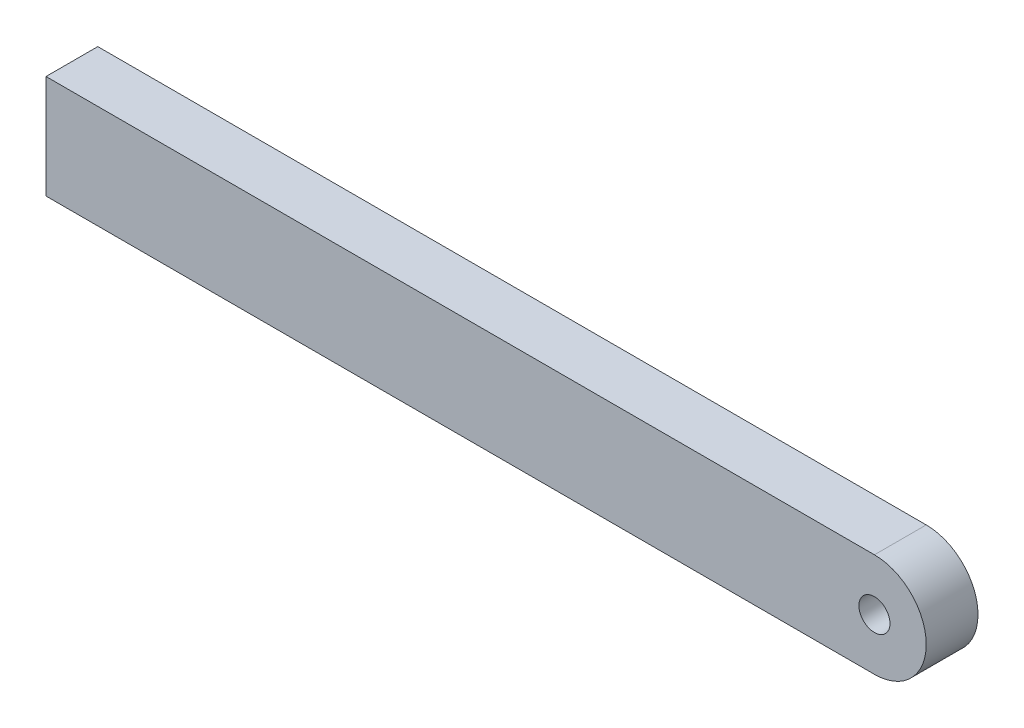
ISO-10303-21;
HEADER;
FILE_DESCRIPTION(('STEP AP214'),'2;1');
FILE_NAME('part.step','',(''),(''),'','','');
FILE_SCHEMA(('AUTOMOTIVE_DESIGN { 1 0 10303 214 1 1 1 1 }'));
ENDSEC;
DATA;
#1=APPLICATION_CONTEXT('core data for automotive mechanical design processes');
#2=APPLICATION_PROTOCOL_DEFINITION('international standard','automotive_design',2000,#1);
#3=PRODUCT_CONTEXT('',#1,'mechanical');
#4=PRODUCT('Part','Part','',(#3));
#5=PRODUCT_RELATED_PRODUCT_CATEGORY('part','',(#4));
#6=PRODUCT_DEFINITION_FORMATION('','',#4);
#7=PRODUCT_DEFINITION_CONTEXT('part definition',#1,'design');
#8=PRODUCT_DEFINITION('design','',#6,#7);
#9=PRODUCT_DEFINITION_SHAPE('','',#8);
#10=(LENGTH_UNIT() NAMED_UNIT(*) SI_UNIT(.MILLI.,.METRE.));
#11=(NAMED_UNIT(*) PLANE_ANGLE_UNIT() SI_UNIT($,.RADIAN.));
#12=(NAMED_UNIT(*) SI_UNIT($,.STERADIAN.) SOLID_ANGLE_UNIT());
#13=UNCERTAINTY_MEASURE_WITH_UNIT(LENGTH_MEASURE(1.E-05),#10,'distance_accuracy_value','');
#14=(GEOMETRIC_REPRESENTATION_CONTEXT(3) GLOBAL_UNCERTAINTY_ASSIGNED_CONTEXT((#13)) GLOBAL_UNIT_ASSIGNED_CONTEXT((#10,
#11,#12)) REPRESENTATION_CONTEXT('',''));
#15=CARTESIAN_POINT('',(0.,0.,0.));
#16=DIRECTION('',(0.,0.,1.));
#17=DIRECTION('',(1.,0.,0.));
#18=AXIS2_PLACEMENT_3D('',#15,#16,#17);
#19=CARTESIAN_POINT('',(40.,0.,5.));
#20=DIRECTION('',(0.,0.,1.));
#21=DIRECTION('',(1.,0.,0.));
#22=AXIS2_PLACEMENT_3D('',#19,#20,#21);
#23=PLANE('',#22);
#24=CARTESIAN_POINT('',(40.,0.,5.));
#25=DIRECTION('',(0.,0.,1.));
#26=DIRECTION('',(1.,0.,0.));
#27=AXIS2_PLACEMENT_3D('',#24,#25,#26);
#28=CIRCLE('',#27,5.);
#29=CARTESIAN_POINT('',(40.,-5.,5.));
#30=VERTEX_POINT('',#29);
#31=CARTESIAN_POINT('',(40.,5.,5.));
#32=VERTEX_POINT('',#31);
#33=EDGE_CURVE('E87',#30,#32,#28,.T.);
#34=ORIENTED_EDGE('',*,*,#33,.T.);
#35=DIRECTION('',(-1.,0.,0.));
#36=VECTOR('',#35,1.);
#37=CARTESIAN_POINT('',(-40.,5.,5.));
#38=LINE('',#37,#36);
#39=CARTESIAN_POINT('',(-40.,5.,5.));
#40=VERTEX_POINT('',#39);
#41=EDGE_CURVE('E82',#32,#40,#38,.T.);
#42=ORIENTED_EDGE('',*,*,#41,.T.);
#43=DIRECTION('',(0.,-1.,0.));
#44=VECTOR('',#43,1.);
#45=CARTESIAN_POINT('',(-40.,-5.,5.));
#46=LINE('',#45,#44);
#47=CARTESIAN_POINT('',(-40.,-5.,5.));
#48=VERTEX_POINT('',#47);
#49=EDGE_CURVE('E85',#40,#48,#46,.T.);
#50=ORIENTED_EDGE('',*,*,#49,.T.);
#51=DIRECTION('',(1.,0.,0.));
#52=VECTOR('',#51,1.);
#53=CARTESIAN_POINT('',(-40.,-5.,5.));
#54=LINE('',#53,#52);
#55=EDGE_CURVE('E52',#48,#30,#54,.T.);
#56=ORIENTED_EDGE('',*,*,#55,.T.);
#57=EDGE_LOOP('',(#34,#42,#50,#56));
#58=FACE_BOUND('',#57,.T.);
#59=CARTESIAN_POINT('',(40.,0.,5.));
#60=DIRECTION('',(0.,0.,1.));
#61=DIRECTION('',(1.,0.,0.));
#62=AXIS2_PLACEMENT_3D('',#59,#60,#61);
#63=CIRCLE('',#62,1.5);
#64=CARTESIAN_POINT('',(41.5,0.,5.));
#65=VERTEX_POINT('',#64);
#66=EDGE_CURVE('E102',#65,#65,#63,.T.);
#67=ORIENTED_EDGE('',*,*,#66,.F.);
#68=EDGE_LOOP('',(#67));
#69=FACE_BOUND('',#68,.T.);
#70=ADVANCED_FACE('F35',(#58,#69),#23,.T.);
#71=CARTESIAN_POINT('',(40.,0.,0.));
#72=DIRECTION('',(0.,0.,1.));
#73=DIRECTION('',(1.,0.,0.));
#74=AXIS2_PLACEMENT_3D('',#71,#72,#73);
#75=PLANE('',#74);
#76=CARTESIAN_POINT('',(40.,0.,0.));
#77=DIRECTION('',(0.,0.,1.));
#78=DIRECTION('',(1.,0.,0.));
#79=AXIS2_PLACEMENT_3D('',#76,#77,#78);
#80=CIRCLE('',#79,5.);
#81=CARTESIAN_POINT('',(40.,-5.,0.));
#82=VERTEX_POINT('',#81);
#83=CARTESIAN_POINT('',(40.,5.,0.));
#84=VERTEX_POINT('',#83);
#85=EDGE_CURVE('E99',#82,#84,#80,.T.);
#86=ORIENTED_EDGE('',*,*,#85,.F.);
#87=DIRECTION('',(1.,0.,0.));
#88=VECTOR('',#87,1.);
#89=CARTESIAN_POINT('',(-40.,-5.,0.));
#90=LINE('',#89,#88);
#91=CARTESIAN_POINT('',(-40.,-5.,0.));
#92=VERTEX_POINT('',#91);
#93=EDGE_CURVE('E75',#92,#82,#90,.T.);
#94=ORIENTED_EDGE('',*,*,#93,.F.);
#95=DIRECTION('',(0.,-1.,0.));
#96=VECTOR('',#95,1.);
#97=CARTESIAN_POINT('',(-40.,-5.,0.));
#98=LINE('',#97,#96);
#99=CARTESIAN_POINT('',(-40.,5.,0.));
#100=VERTEX_POINT('',#99);
#101=EDGE_CURVE('E69',#100,#92,#98,.T.);
#102=ORIENTED_EDGE('',*,*,#101,.F.);
#103=DIRECTION('',(-1.,0.,0.));
#104=VECTOR('',#103,1.);
#105=CARTESIAN_POINT('',(-40.,5.,0.));
#106=LINE('',#105,#104);
#107=EDGE_CURVE('E91',#84,#100,#106,.T.);
#108=ORIENTED_EDGE('',*,*,#107,.F.);
#109=EDGE_LOOP('',(#86,#94,#102,#108));
#110=FACE_BOUND('',#109,.T.);
#111=CARTESIAN_POINT('',(40.,0.,0.));
#112=DIRECTION('',(0.,0.,1.));
#113=DIRECTION('',(1.,0.,0.));
#114=AXIS2_PLACEMENT_3D('',#111,#112,#113);
#115=CIRCLE('',#114,1.5);
#116=CARTESIAN_POINT('',(41.5,0.,0.));
#117=VERTEX_POINT('',#116);
#118=EDGE_CURVE('E114',#117,#117,#115,.T.);
#119=ORIENTED_EDGE('',*,*,#118,.T.);
#120=EDGE_LOOP('',(#119));
#121=FACE_BOUND('',#120,.T.);
#122=ADVANCED_FACE('F110',(#110,#121),#75,.F.);
#123=CARTESIAN_POINT('',(40.,0.,5.));
#124=DIRECTION('',(0.,0.,-1.));
#125=DIRECTION('',(-1.,0.,0.));
#126=AXIS2_PLACEMENT_3D('',#123,#124,#125);
#127=CYLINDRICAL_SURFACE('',#126,5.);
#128=ORIENTED_EDGE('',*,*,#85,.T.);
#129=DIRECTION('',(0.,0.,-1.));
#130=VECTOR('',#129,1.);
#131=CARTESIAN_POINT('',(40.,5.,5.));
#132=LINE('',#131,#130);
#133=EDGE_CURVE('E11',#32,#84,#132,.T.);
#134=ORIENTED_EDGE('',*,*,#133,.F.);
#135=ORIENTED_EDGE('',*,*,#33,.F.);
#136=DIRECTION('',(0.,0.,-1.));
#137=VECTOR('',#136,1.);
#138=CARTESIAN_POINT('',(40.,-5.,5.));
#139=LINE('',#138,#137);
#140=EDGE_CURVE('E95',#30,#82,#139,.T.);
#141=ORIENTED_EDGE('',*,*,#140,.T.);
#142=EDGE_LOOP('',(#128,#134,#135,#141));
#143=FACE_BOUND('',#142,.T.);
#144=ADVANCED_FACE('F37',(#143),#127,.T.);
#145=CARTESIAN_POINT('',(-40.,5.,5.));
#146=DIRECTION('',(0.,-1.,0.));
#147=DIRECTION('',(0.,0.,-1.));
#148=AXIS2_PLACEMENT_3D('',#145,#146,#147);
#149=PLANE('',#148);
#150=ORIENTED_EDGE('',*,*,#107,.T.);
#151=DIRECTION('',(0.,0.,-1.));
#152=VECTOR('',#151,1.);
#153=CARTESIAN_POINT('',(-40.,5.,5.));
#154=LINE('',#153,#152);
#155=EDGE_CURVE('E44',#40,#100,#154,.T.);
#156=ORIENTED_EDGE('',*,*,#155,.F.);
#157=ORIENTED_EDGE('',*,*,#41,.F.);
#158=ORIENTED_EDGE('',*,*,#133,.T.);
#159=EDGE_LOOP('',(#150,#156,#157,#158));
#160=FACE_BOUND('',#159,.T.);
#161=ADVANCED_FACE('F90',(#160),#149,.F.);
#162=CARTESIAN_POINT('',(-40.,-5.,5.));
#163=DIRECTION('',(1.,0.,0.));
#164=DIRECTION('',(0.,0.,-1.));
#165=AXIS2_PLACEMENT_3D('',#162,#163,#164);
#166=PLANE('',#165);
#167=ORIENTED_EDGE('',*,*,#101,.T.);
#168=DIRECTION('',(0.,0.,-1.));
#169=VECTOR('',#168,1.);
#170=CARTESIAN_POINT('',(-40.,-5.,5.));
#171=LINE('',#170,#169);
#172=EDGE_CURVE('E92',#48,#92,#171,.T.);
#173=ORIENTED_EDGE('',*,*,#172,.F.);
#174=ORIENTED_EDGE('',*,*,#49,.F.);
#175=ORIENTED_EDGE('',*,*,#155,.T.);
#176=EDGE_LOOP('',(#167,#173,#174,#175));
#177=FACE_BOUND('',#176,.T.);
#178=ADVANCED_FACE('F93',(#177),#166,.F.);
#179=CARTESIAN_POINT('',(-40.,-5.,5.));
#180=DIRECTION('',(0.,1.,0.));
#181=DIRECTION('',(0.,0.,1.));
#182=AXIS2_PLACEMENT_3D('',#179,#180,#181);
#183=PLANE('',#182);
#184=ORIENTED_EDGE('',*,*,#93,.T.);
#185=ORIENTED_EDGE('',*,*,#140,.F.);
#186=ORIENTED_EDGE('',*,*,#55,.F.);
#187=ORIENTED_EDGE('',*,*,#172,.T.);
#188=EDGE_LOOP('',(#184,#185,#186,#187));
#189=FACE_BOUND('',#188,.T.);
#190=ADVANCED_FACE('F107',(#189),#183,.F.);
#191=CARTESIAN_POINT('',(40.,0.,5.));
#192=DIRECTION('',(0.,0.,-1.));
#193=DIRECTION('',(-1.,0.,0.));
#194=AXIS2_PLACEMENT_3D('',#191,#192,#193);
#195=CYLINDRICAL_SURFACE('',#194,1.5);
#196=ORIENTED_EDGE('',*,*,#66,.T.);
#197=EDGE_LOOP('',(#196));
#198=FACE_BOUND('',#197,.T.);
#199=ORIENTED_EDGE('',*,*,#118,.F.);
#200=EDGE_LOOP('',(#199));
#201=FACE_BOUND('',#200,.T.);
#202=ADVANCED_FACE('F120',(#198,#201),#195,.F.);
#203=CLOSED_SHELL('',(#70,#122,#144,#161,#178,#190,#202));
#204=MANIFOLD_SOLID_BREP('B2',#203);
#205=ADVANCED_BREP_SHAPE_REPRESENTATION('',(#18,#204),#14);
#206=SHAPE_DEFINITION_REPRESENTATION(#9,#205);
ENDSEC;
END-ISO-10303-21;
